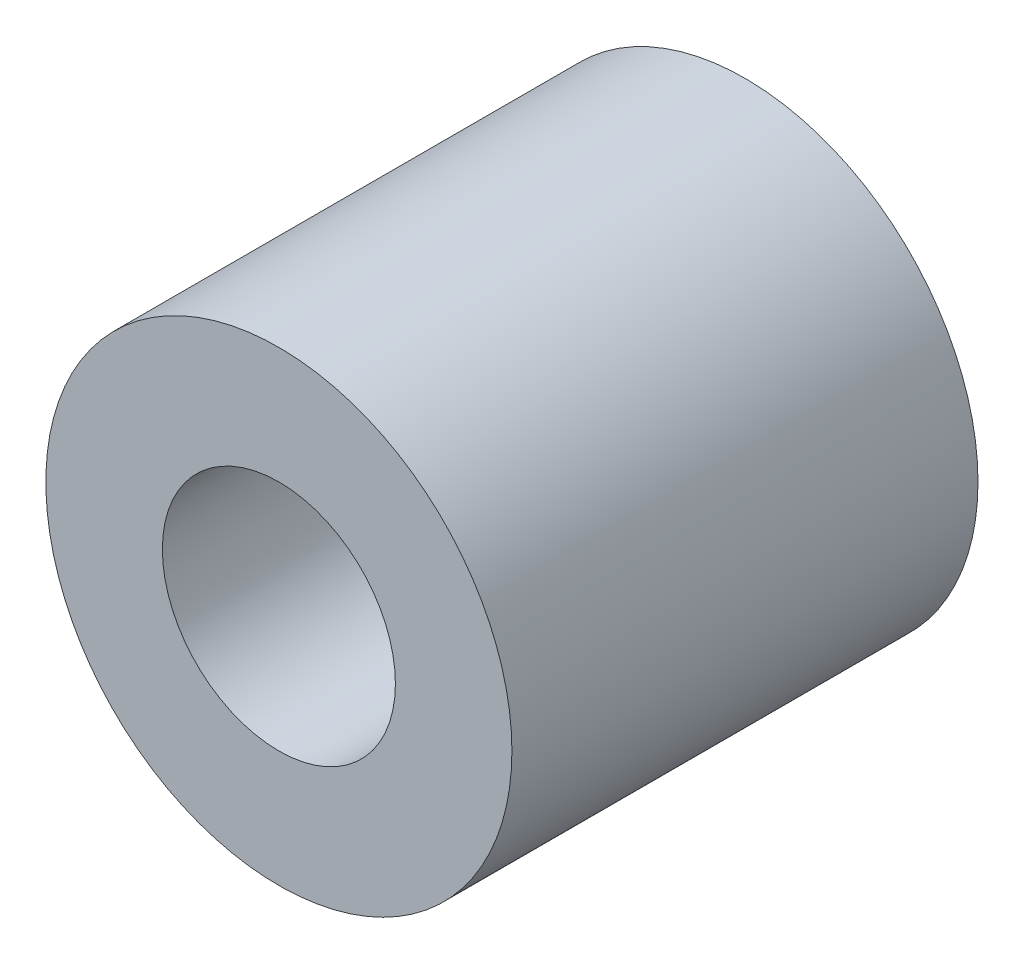
ISO-10303-21;
HEADER;
FILE_DESCRIPTION(('STEP AP214'),'2;1');
FILE_NAME('part.step','',(''),(''),'','','');
FILE_SCHEMA(('AUTOMOTIVE_DESIGN { 1 0 10303 214 1 1 1 1 }'));
ENDSEC;
DATA;
#1=APPLICATION_CONTEXT('core data for automotive mechanical design processes');
#2=APPLICATION_PROTOCOL_DEFINITION('international standard','automotive_design',2000,#1);
#3=PRODUCT_CONTEXT('',#1,'mechanical');
#4=PRODUCT('Part','Part','',(#3));
#5=PRODUCT_RELATED_PRODUCT_CATEGORY('part','',(#4));
#6=PRODUCT_DEFINITION_FORMATION('','',#4);
#7=PRODUCT_DEFINITION_CONTEXT('part definition',#1,'design');
#8=PRODUCT_DEFINITION('design','',#6,#7);
#9=PRODUCT_DEFINITION_SHAPE('','',#8);
#10=(LENGTH_UNIT() NAMED_UNIT(*) SI_UNIT(.MILLI.,.METRE.));
#11=(NAMED_UNIT(*) PLANE_ANGLE_UNIT() SI_UNIT($,.RADIAN.));
#12=(NAMED_UNIT(*) SI_UNIT($,.STERADIAN.) SOLID_ANGLE_UNIT());
#13=UNCERTAINTY_MEASURE_WITH_UNIT(LENGTH_MEASURE(1.E-05),#10,'distance_accuracy_value','');
#14=(GEOMETRIC_REPRESENTATION_CONTEXT(3) GLOBAL_UNCERTAINTY_ASSIGNED_CONTEXT((#13)) GLOBAL_UNIT_ASSIGNED_CONTEXT((#10,
#11,#12)) REPRESENTATION_CONTEXT('',''));
#15=CARTESIAN_POINT('',(0.,0.,0.));
#16=DIRECTION('',(0.,0.,1.));
#17=DIRECTION('',(1.,0.,0.));
#18=AXIS2_PLACEMENT_3D('',#15,#16,#17);
#19=CARTESIAN_POINT('',(0.,0.,6.35));
#20=DIRECTION('',(0.,0.,1.));
#21=DIRECTION('',(1.,0.,0.));
#22=AXIS2_PLACEMENT_3D('',#19,#20,#21);
#23=PLANE('',#22);
#24=CARTESIAN_POINT('',(0.,0.,6.35));
#25=DIRECTION('',(0.,0.,1.));
#26=DIRECTION('',(1.,0.,0.));
#27=AXIS2_PLACEMENT_3D('',#24,#25,#26);
#28=CIRCLE('',#27,6.35);
#29=CARTESIAN_POINT('',(6.35,0.,6.35));
#30=VERTEX_POINT('',#29);
#31=EDGE_CURVE('E10',#30,#30,#28,.T.);
#32=ORIENTED_EDGE('',*,*,#31,.T.);
#33=EDGE_LOOP('',(#32));
#34=FACE_BOUND('',#33,.T.);
#35=CARTESIAN_POINT('',(0.,0.,6.35));
#36=DIRECTION('',(0.,0.,1.));
#37=DIRECTION('',(1.,0.,0.));
#38=AXIS2_PLACEMENT_3D('',#35,#36,#37);
#39=CIRCLE('',#38,3.175);
#40=CARTESIAN_POINT('',(3.175,0.,6.35));
#41=VERTEX_POINT('',#40);
#42=EDGE_CURVE('E42',#41,#41,#39,.T.);
#43=ORIENTED_EDGE('',*,*,#42,.F.);
#44=EDGE_LOOP('',(#43));
#45=FACE_BOUND('',#44,.T.);
#46=ADVANCED_FACE('F31',(#34,#45),#23,.T.);
#47=CARTESIAN_POINT('',(0.,0.,-6.35));
#48=DIRECTION('',(0.,0.,1.));
#49=DIRECTION('',(1.,0.,0.));
#50=AXIS2_PLACEMENT_3D('',#47,#48,#49);
#51=PLANE('',#50);
#52=CARTESIAN_POINT('',(0.,0.,-6.35));
#53=DIRECTION('',(0.,0.,1.));
#54=DIRECTION('',(1.,0.,0.));
#55=AXIS2_PLACEMENT_3D('',#52,#53,#54);
#56=CIRCLE('',#55,6.35);
#57=CARTESIAN_POINT('',(6.35,0.,-6.35));
#58=VERTEX_POINT('',#57);
#59=EDGE_CURVE('E35',#58,#58,#56,.T.);
#60=ORIENTED_EDGE('',*,*,#59,.F.);
#61=EDGE_LOOP('',(#60));
#62=FACE_BOUND('',#61,.T.);
#63=CARTESIAN_POINT('',(0.,0.,-6.35));
#64=DIRECTION('',(0.,0.,1.));
#65=DIRECTION('',(1.,0.,0.));
#66=AXIS2_PLACEMENT_3D('',#63,#64,#65);
#67=CIRCLE('',#66,3.175);
#68=CARTESIAN_POINT('',(3.175,0.,-6.35));
#69=VERTEX_POINT('',#68);
#70=EDGE_CURVE('E44',#69,#69,#67,.T.);
#71=ORIENTED_EDGE('',*,*,#70,.T.);
#72=EDGE_LOOP('',(#71));
#73=FACE_BOUND('',#72,.T.);
#74=ADVANCED_FACE('F54',(#62,#73),#51,.F.);
#75=CARTESIAN_POINT('',(0.,0.,6.35));
#76=DIRECTION('',(0.,0.,-1.));
#77=DIRECTION('',(-1.,0.,0.));
#78=AXIS2_PLACEMENT_3D('',#75,#76,#77);
#79=CYLINDRICAL_SURFACE('',#78,6.35);
#80=ORIENTED_EDGE('',*,*,#31,.F.);
#81=EDGE_LOOP('',(#80));
#82=FACE_BOUND('',#81,.T.);
#83=ORIENTED_EDGE('',*,*,#59,.T.);
#84=EDGE_LOOP('',(#83));
#85=FACE_BOUND('',#84,.T.);
#86=ADVANCED_FACE('F33',(#82,#85),#79,.T.);
#87=CARTESIAN_POINT('',(0.,0.,6.35));
#88=DIRECTION('',(0.,0.,-1.));
#89=DIRECTION('',(-1.,0.,0.));
#90=AXIS2_PLACEMENT_3D('',#87,#88,#89);
#91=CYLINDRICAL_SURFACE('',#90,3.175);
#92=ORIENTED_EDGE('',*,*,#42,.T.);
#93=EDGE_LOOP('',(#92));
#94=FACE_BOUND('',#93,.T.);
#95=ORIENTED_EDGE('',*,*,#70,.F.);
#96=EDGE_LOOP('',(#95));
#97=FACE_BOUND('',#96,.T.);
#98=ADVANCED_FACE('F50',(#94,#97),#91,.F.);
#99=CLOSED_SHELL('',(#46,#74,#86,#98));
#100=MANIFOLD_SOLID_BREP('B2',#99);
#101=ADVANCED_BREP_SHAPE_REPRESENTATION('',(#18,#100),#14);
#102=SHAPE_DEFINITION_REPRESENTATION(#9,#101);
ENDSEC;
END-ISO-10303-21;
